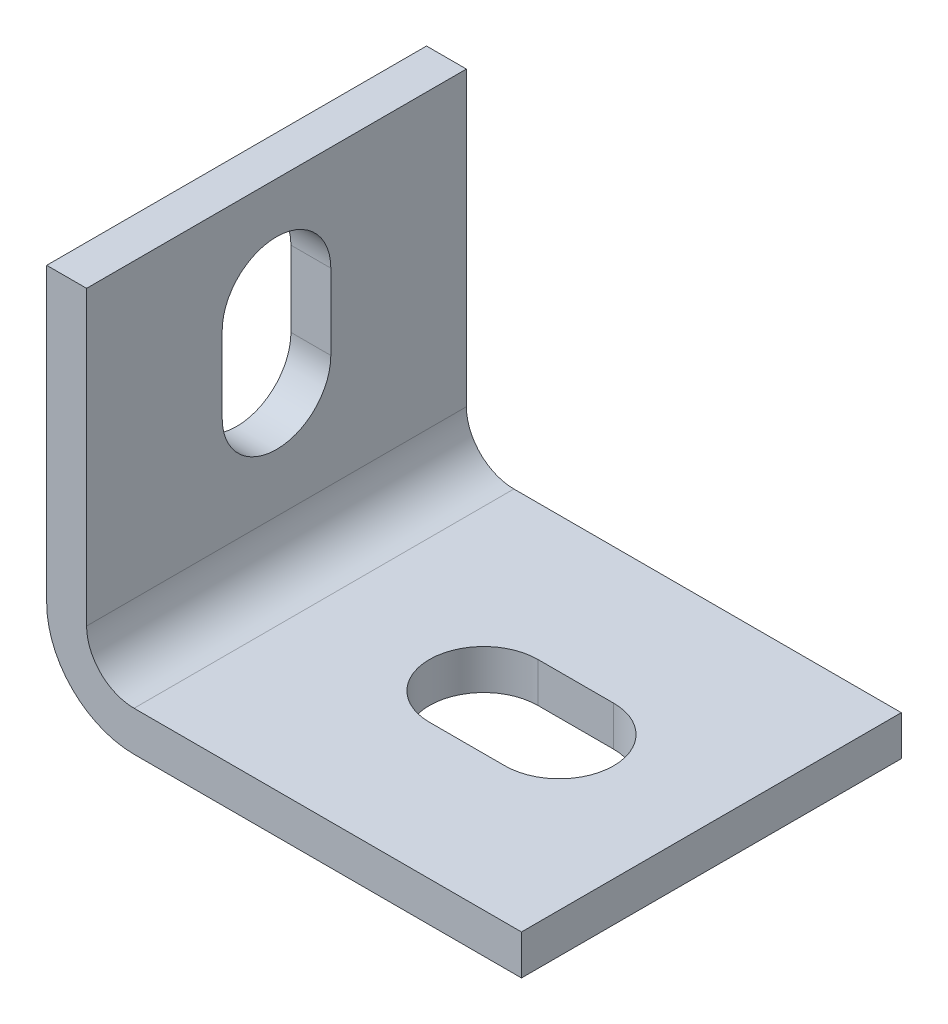
ISO-10303-21;
HEADER;
FILE_DESCRIPTION(('STEP AP214'),'2;1');
FILE_NAME('part.step','',(''),(''),'','','');
FILE_SCHEMA(('AUTOMOTIVE_DESIGN { 1 0 10303 214 1 1 1 1 }'));
ENDSEC;
DATA;
#1=APPLICATION_CONTEXT('core data for automotive mechanical design processes');
#2=APPLICATION_PROTOCOL_DEFINITION('international standard','automotive_design',2000,#1);
#3=PRODUCT_CONTEXT('',#1,'mechanical');
#4=PRODUCT('Part','Part','',(#3));
#5=PRODUCT_RELATED_PRODUCT_CATEGORY('part','',(#4));
#6=PRODUCT_DEFINITION_FORMATION('','',#4);
#7=PRODUCT_DEFINITION_CONTEXT('part definition',#1,'design');
#8=PRODUCT_DEFINITION('design','',#6,#7);
#9=PRODUCT_DEFINITION_SHAPE('','',#8);
#10=(LENGTH_UNIT() NAMED_UNIT(*) SI_UNIT(.MILLI.,.METRE.));
#11=(NAMED_UNIT(*) PLANE_ANGLE_UNIT() SI_UNIT($,.RADIAN.));
#12=(NAMED_UNIT(*) SI_UNIT($,.STERADIAN.) SOLID_ANGLE_UNIT());
#13=UNCERTAINTY_MEASURE_WITH_UNIT(LENGTH_MEASURE(1.E-05),#10,'distance_accuracy_value','');
#14=(GEOMETRIC_REPRESENTATION_CONTEXT(3) GLOBAL_UNCERTAINTY_ASSIGNED_CONTEXT((#13)) GLOBAL_UNIT_ASSIGNED_CONTEXT((#10,
#11,#12)) REPRESENTATION_CONTEXT('',''));
#15=CARTESIAN_POINT('',(0.,0.,0.));
#16=DIRECTION('',(0.,0.,1.));
#17=DIRECTION('',(1.,0.,0.));
#18=AXIS2_PLACEMENT_3D('',#15,#16,#17);
#19=CARTESIAN_POINT('',(0.,25.4,25.4));
#20=DIRECTION('',(0.,-1.,0.));
#21=DIRECTION('',(0.,0.,-1.));
#22=AXIS2_PLACEMENT_3D('',#19,#20,#21);
#23=PLANE('',#22);
#24=DIRECTION('',(-1.,0.,0.));
#25=VECTOR('',#24,1.);
#26=CARTESIAN_POINT('',(0.,25.4,0.));
#27=LINE('',#26,#25);
#28=CARTESIAN_POINT('',(2.667,25.4,0.));
#29=VERTEX_POINT('',#28);
#30=CARTESIAN_POINT('',(0.,25.4,0.));
#31=VERTEX_POINT('',#30);
#32=EDGE_CURVE('E210',#29,#31,#27,.T.);
#33=ORIENTED_EDGE('',*,*,#32,.T.);
#34=DIRECTION('',(0.,0.,-1.));
#35=VECTOR('',#34,1.);
#36=CARTESIAN_POINT('',(0.,25.4,25.4));
#37=LINE('',#36,#35);
#38=CARTESIAN_POINT('',(0.,25.4,25.4));
#39=VERTEX_POINT('',#38);
#40=EDGE_CURVE('E11',#39,#31,#37,.T.);
#41=ORIENTED_EDGE('',*,*,#40,.F.);
#42=DIRECTION('',(-1.,0.,0.));
#43=VECTOR('',#42,1.);
#44=CARTESIAN_POINT('',(0.,25.4,25.4));
#45=LINE('',#44,#43);
#46=CARTESIAN_POINT('',(2.667,25.4,25.4));
#47=VERTEX_POINT('',#46);
#48=EDGE_CURVE('E217',#47,#39,#45,.T.);
#49=ORIENTED_EDGE('',*,*,#48,.F.);
#50=DIRECTION('',(0.,0.,-1.));
#51=VECTOR('',#50,1.);
#52=CARTESIAN_POINT('',(2.667,25.4,25.4));
#53=LINE('',#52,#51);
#54=EDGE_CURVE('E235',#47,#29,#53,.T.);
#55=ORIENTED_EDGE('',*,*,#54,.T.);
#56=EDGE_LOOP('',(#33,#41,#49,#55));
#57=FACE_BOUND('',#56,.T.);
#58=ADVANCED_FACE('F36',(#57),#23,.F.);
#59=CARTESIAN_POINT('',(0.,5.842,25.4));
#60=DIRECTION('',(1.,0.,0.));
#61=DIRECTION('',(0.,0.,-1.));
#62=AXIS2_PLACEMENT_3D('',#59,#60,#61);
#63=PLANE('',#62);
#64=DIRECTION('',(0.,1.,0.));
#65=VECTOR('',#64,1.);
#66=CARTESIAN_POINT('',(0.,18.4023,9.0678));
#67=LINE('',#66,#65);
#68=CARTESIAN_POINT('',(0.,13.3477,9.0678));
#69=VERTEX_POINT('',#68);
#70=CARTESIAN_POINT('',(0.,18.4023,9.0678));
#71=VERTEX_POINT('',#70);
#72=EDGE_CURVE('E195',#69,#71,#67,.T.);
#73=ORIENTED_EDGE('',*,*,#72,.T.);
#74=CARTESIAN_POINT('',(0.,18.4023,12.7));
#75=DIRECTION('',(1.,0.,0.));
#76=DIRECTION('',(0.,1.,0.));
#77=AXIS2_PLACEMENT_3D('',#74,#75,#76);
#78=CIRCLE('',#77,3.6322);
#79=CARTESIAN_POINT('',(0.,18.4023,16.3322));
#80=VERTEX_POINT('',#79);
#81=EDGE_CURVE('E185',#71,#80,#78,.T.);
#82=ORIENTED_EDGE('',*,*,#81,.T.);
#83=DIRECTION('',(0.,-1.,0.));
#84=VECTOR('',#83,1.);
#85=CARTESIAN_POINT('',(0.,18.4023,16.3322));
#86=LINE('',#85,#84);
#87=CARTESIAN_POINT('',(0.,13.3477,16.3322));
#88=VERTEX_POINT('',#87);
#89=EDGE_CURVE('E188',#80,#88,#86,.T.);
#90=ORIENTED_EDGE('',*,*,#89,.T.);
#91=CARTESIAN_POINT('',(0.,13.3477,12.7));
#92=DIRECTION('',(1.,0.,0.));
#93=DIRECTION('',(0.,1.,0.));
#94=AXIS2_PLACEMENT_3D('',#91,#92,#93);
#95=CIRCLE('',#94,3.6322);
#96=EDGE_CURVE('E192',#88,#69,#95,.T.);
#97=ORIENTED_EDGE('',*,*,#96,.T.);
#98=EDGE_LOOP('',(#73,#82,#90,#97));
#99=FACE_BOUND('',#98,.T.);
#100=DIRECTION('',(0.,-1.,0.));
#101=VECTOR('',#100,1.);
#102=CARTESIAN_POINT('',(0.,5.842,0.));
#103=LINE('',#102,#101);
#104=CARTESIAN_POINT('',(0.,5.842,0.));
#105=VERTEX_POINT('',#104);
#106=EDGE_CURVE('E238',#31,#105,#103,.T.);
#107=ORIENTED_EDGE('',*,*,#106,.T.);
#108=DIRECTION('',(0.,0.,-1.));
#109=VECTOR('',#108,1.);
#110=CARTESIAN_POINT('',(0.,5.842,25.4));
#111=LINE('',#110,#109);
#112=CARTESIAN_POINT('',(0.,5.842,25.4));
#113=VERTEX_POINT('',#112);
#114=EDGE_CURVE('E43',#113,#105,#111,.T.);
#115=ORIENTED_EDGE('',*,*,#114,.F.);
#116=DIRECTION('',(0.,-1.,0.));
#117=VECTOR('',#116,1.);
#118=CARTESIAN_POINT('',(0.,5.842,25.4));
#119=LINE('',#118,#117);
#120=EDGE_CURVE('E220',#39,#113,#119,.T.);
#121=ORIENTED_EDGE('',*,*,#120,.F.);
#122=ORIENTED_EDGE('',*,*,#40,.T.);
#123=EDGE_LOOP('',(#107,#115,#121,#122));
#124=FACE_BOUND('',#123,.T.);
#125=ADVANCED_FACE('F293',(#99,#124),#63,.F.);
#126=CARTESIAN_POINT('',(5.842,5.842,25.4));
#127=DIRECTION('',(0.,0.,-1.));
#128=DIRECTION('',(-1.,0.,0.));
#129=AXIS2_PLACEMENT_3D('',#126,#127,#128);
#130=CYLINDRICAL_SURFACE('',#129,5.842);
#131=CARTESIAN_POINT('',(5.842,5.842,0.));
#132=DIRECTION('',(0.,0.,1.));
#133=DIRECTION('',(1.,0.,0.));
#134=AXIS2_PLACEMENT_3D('',#131,#132,#133);
#135=CIRCLE('',#134,5.842);
#136=CARTESIAN_POINT('',(5.842,0.,0.));
#137=VERTEX_POINT('',#136);
#138=EDGE_CURVE('E240',#105,#137,#135,.T.);
#139=ORIENTED_EDGE('',*,*,#138,.T.);
#140=DIRECTION('',(0.,0.,-1.));
#141=VECTOR('',#140,1.);
#142=CARTESIAN_POINT('',(5.842,0.,25.4));
#143=LINE('',#142,#141);
#144=CARTESIAN_POINT('',(5.842,0.,25.4));
#145=VERTEX_POINT('',#144);
#146=EDGE_CURVE('E265',#145,#137,#143,.T.);
#147=ORIENTED_EDGE('',*,*,#146,.F.);
#148=CARTESIAN_POINT('',(5.842,5.842,25.4));
#149=DIRECTION('',(0.,0.,1.));
#150=DIRECTION('',(1.,0.,0.));
#151=AXIS2_PLACEMENT_3D('',#148,#149,#150);
#152=CIRCLE('',#151,5.842);
#153=EDGE_CURVE('E223',#113,#145,#152,.T.);
#154=ORIENTED_EDGE('',*,*,#153,.F.);
#155=ORIENTED_EDGE('',*,*,#114,.T.);
#156=EDGE_LOOP('',(#139,#147,#154,#155));
#157=FACE_BOUND('',#156,.T.);
#158=ADVANCED_FACE('F272',(#157),#130,.T.);
#159=CARTESIAN_POINT('',(5.842,0.,25.4));
#160=DIRECTION('',(0.,1.,0.));
#161=DIRECTION('',(0.,0.,1.));
#162=AXIS2_PLACEMENT_3D('',#159,#160,#161);
#163=PLANE('',#162);
#164=DIRECTION('',(1.,0.,0.));
#165=VECTOR('',#164,1.);
#166=CARTESIAN_POINT('',(21.5773,0.,16.3322));
#167=LINE('',#166,#165);
#168=CARTESIAN_POINT('',(16.5227,0.,16.3322));
#169=VERTEX_POINT('',#168);
#170=CARTESIAN_POINT('',(21.5773,0.,16.3322));
#171=VERTEX_POINT('',#170);
#172=EDGE_CURVE('E156',#169,#171,#167,.T.);
#173=ORIENTED_EDGE('',*,*,#172,.T.);
#174=CARTESIAN_POINT('',(21.5773,0.,12.7));
#175=DIRECTION('',(0.,1.,0.));
#176=DIRECTION('',(-1.,0.,0.));
#177=AXIS2_PLACEMENT_3D('',#174,#175,#176);
#178=CIRCLE('',#177,3.6322);
#179=CARTESIAN_POINT('',(21.5773,0.,9.0678));
#180=VERTEX_POINT('',#179);
#181=EDGE_CURVE('E150',#171,#180,#178,.T.);
#182=ORIENTED_EDGE('',*,*,#181,.T.);
#183=DIRECTION('',(-1.,0.,0.));
#184=VECTOR('',#183,1.);
#185=CARTESIAN_POINT('',(21.5773,0.,9.0678));
#186=LINE('',#185,#184);
#187=CARTESIAN_POINT('',(16.5227,0.,9.0678));
#188=VERTEX_POINT('',#187);
#189=EDGE_CURVE('E159',#180,#188,#186,.T.);
#190=ORIENTED_EDGE('',*,*,#189,.T.);
#191=CARTESIAN_POINT('',(16.5227,0.,12.7));
#192=DIRECTION('',(0.,1.,0.));
#193=DIRECTION('',(-1.,0.,0.));
#194=AXIS2_PLACEMENT_3D('',#191,#192,#193);
#195=CIRCLE('',#194,3.6322);
#196=EDGE_CURVE('E50',#188,#169,#195,.T.);
#197=ORIENTED_EDGE('',*,*,#196,.T.);
#198=EDGE_LOOP('',(#173,#182,#190,#197));
#199=FACE_BOUND('',#198,.T.);
#200=DIRECTION('',(1.,0.,0.));
#201=VECTOR('',#200,1.);
#202=CARTESIAN_POINT('',(5.842,0.,0.));
#203=LINE('',#202,#201);
#204=CARTESIAN_POINT('',(31.75,0.,0.));
#205=VERTEX_POINT('',#204);
#206=EDGE_CURVE('E242',#137,#205,#203,.T.);
#207=ORIENTED_EDGE('',*,*,#206,.T.);
#208=DIRECTION('',(0.,0.,-1.));
#209=VECTOR('',#208,1.);
#210=CARTESIAN_POINT('',(31.75,0.,25.4));
#211=LINE('',#210,#209);
#212=CARTESIAN_POINT('',(31.75,0.,25.4));
#213=VERTEX_POINT('',#212);
#214=EDGE_CURVE('E262',#213,#205,#211,.T.);
#215=ORIENTED_EDGE('',*,*,#214,.F.);
#216=DIRECTION('',(1.,0.,0.));
#217=VECTOR('',#216,1.);
#218=CARTESIAN_POINT('',(5.842,0.,25.4));
#219=LINE('',#218,#217);
#220=EDGE_CURVE('E225',#145,#213,#219,.T.);
#221=ORIENTED_EDGE('',*,*,#220,.F.);
#222=ORIENTED_EDGE('',*,*,#146,.T.);
#223=EDGE_LOOP('',(#207,#215,#221,#222));
#224=FACE_BOUND('',#223,.T.);
#225=ADVANCED_FACE('F163',(#199,#224),#163,.F.);
#226=CARTESIAN_POINT('',(31.75,2.667,25.4));
#227=DIRECTION('',(-1.,0.,0.));
#228=DIRECTION('',(0.,0.,1.));
#229=AXIS2_PLACEMENT_3D('',#226,#227,#228);
#230=PLANE('',#229);
#231=DIRECTION('',(0.,1.,0.));
#232=VECTOR('',#231,1.);
#233=CARTESIAN_POINT('',(31.75,2.667,0.));
#234=LINE('',#233,#232);
#235=CARTESIAN_POINT('',(31.75,2.667,0.));
#236=VERTEX_POINT('',#235);
#237=EDGE_CURVE('E244',#205,#236,#234,.T.);
#238=ORIENTED_EDGE('',*,*,#237,.T.);
#239=DIRECTION('',(0.,0.,-1.));
#240=VECTOR('',#239,1.);
#241=CARTESIAN_POINT('',(31.75,2.667,25.4));
#242=LINE('',#241,#240);
#243=CARTESIAN_POINT('',(31.75,2.667,25.4));
#244=VERTEX_POINT('',#243);
#245=EDGE_CURVE('E259',#244,#236,#242,.T.);
#246=ORIENTED_EDGE('',*,*,#245,.F.);
#247=DIRECTION('',(0.,1.,0.));
#248=VECTOR('',#247,1.);
#249=CARTESIAN_POINT('',(31.75,2.667,25.4));
#250=LINE('',#249,#248);
#251=EDGE_CURVE('E227',#213,#244,#250,.T.);
#252=ORIENTED_EDGE('',*,*,#251,.F.);
#253=ORIENTED_EDGE('',*,*,#214,.T.);
#254=EDGE_LOOP('',(#238,#246,#252,#253));
#255=FACE_BOUND('',#254,.T.);
#256=ADVANCED_FACE('F285',(#255),#230,.F.);
#257=CARTESIAN_POINT('',(5.842,2.667,25.4));
#258=DIRECTION('',(0.,-1.,0.));
#259=DIRECTION('',(1.,0.,0.));
#260=AXIS2_PLACEMENT_3D('',#257,#258,#259);
#261=PLANE('',#260);
#262=DIRECTION('',(-1.,0.,0.));
#263=VECTOR('',#262,1.);
#264=CARTESIAN_POINT('',(21.5773,2.667,9.0678));
#265=LINE('',#264,#263);
#266=CARTESIAN_POINT('',(21.5773,2.667,9.0678));
#267=VERTEX_POINT('',#266);
#268=CARTESIAN_POINT('',(16.5227,2.667,9.0678));
#269=VERTEX_POINT('',#268);
#270=EDGE_CURVE('E175',#267,#269,#265,.T.);
#271=ORIENTED_EDGE('',*,*,#270,.F.);
#272=CARTESIAN_POINT('',(21.5773,2.667,12.7));
#273=DIRECTION('',(0.,1.,0.));
#274=DIRECTION('',(-1.,0.,0.));
#275=AXIS2_PLACEMENT_3D('',#272,#273,#274);
#276=CIRCLE('',#275,3.6322);
#277=CARTESIAN_POINT('',(21.5773,2.667,16.3322));
#278=VERTEX_POINT('',#277);
#279=EDGE_CURVE('E58',#278,#267,#276,.T.);
#280=ORIENTED_EDGE('',*,*,#279,.F.);
#281=DIRECTION('',(1.,0.,0.));
#282=VECTOR('',#281,1.);
#283=CARTESIAN_POINT('',(21.5773,2.667,16.3322));
#284=LINE('',#283,#282);
#285=CARTESIAN_POINT('',(16.5227,2.667,16.3322));
#286=VERTEX_POINT('',#285);
#287=EDGE_CURVE('E166',#286,#278,#284,.T.);
#288=ORIENTED_EDGE('',*,*,#287,.F.);
#289=CARTESIAN_POINT('',(16.5227,2.667,12.7));
#290=DIRECTION('',(0.,1.,0.));
#291=DIRECTION('',(-1.,0.,0.));
#292=AXIS2_PLACEMENT_3D('',#289,#290,#291);
#293=CIRCLE('',#292,3.6322);
#294=EDGE_CURVE('E169',#269,#286,#293,.T.);
#295=ORIENTED_EDGE('',*,*,#294,.F.);
#296=EDGE_LOOP('',(#271,#280,#288,#295));
#297=FACE_BOUND('',#296,.T.);
#298=DIRECTION('',(-1.,0.,0.));
#299=VECTOR('',#298,1.);
#300=CARTESIAN_POINT('',(5.842,2.667,0.));
#301=LINE('',#300,#299);
#302=CARTESIAN_POINT('',(5.842,2.667,0.));
#303=VERTEX_POINT('',#302);
#304=EDGE_CURVE('E246',#236,#303,#301,.T.);
#305=ORIENTED_EDGE('',*,*,#304,.T.);
#306=DIRECTION('',(0.,0.,-1.));
#307=VECTOR('',#306,1.);
#308=CARTESIAN_POINT('',(5.842,2.667,25.4));
#309=LINE('',#308,#307);
#310=CARTESIAN_POINT('',(5.842,2.667,25.4));
#311=VERTEX_POINT('',#310);
#312=EDGE_CURVE('E256',#311,#303,#309,.T.);
#313=ORIENTED_EDGE('',*,*,#312,.F.);
#314=DIRECTION('',(-1.,0.,0.));
#315=VECTOR('',#314,1.);
#316=CARTESIAN_POINT('',(5.842,2.667,25.4));
#317=LINE('',#316,#315);
#318=EDGE_CURVE('E229',#244,#311,#317,.T.);
#319=ORIENTED_EDGE('',*,*,#318,.F.);
#320=ORIENTED_EDGE('',*,*,#245,.T.);
#321=EDGE_LOOP('',(#305,#313,#319,#320));
#322=FACE_BOUND('',#321,.T.);
#323=ADVANCED_FACE('F306',(#297,#322),#261,.F.);
#324=CARTESIAN_POINT('',(5.842,5.842,25.4));
#325=DIRECTION('',(0.,0.,-1.));
#326=DIRECTION('',(-1.,0.,0.));
#327=AXIS2_PLACEMENT_3D('',#324,#325,#326);
#328=CYLINDRICAL_SURFACE('',#327,3.175);
#329=CARTESIAN_POINT('',(5.842,5.842,0.));
#330=DIRECTION('',(0.,0.,-1.));
#331=DIRECTION('',(-1.,0.,0.));
#332=AXIS2_PLACEMENT_3D('',#329,#330,#331);
#333=CIRCLE('',#332,3.175);
#334=CARTESIAN_POINT('',(2.667,5.842,0.));
#335=VERTEX_POINT('',#334);
#336=EDGE_CURVE('E248',#303,#335,#333,.T.);
#337=ORIENTED_EDGE('',*,*,#336,.T.);
#338=DIRECTION('',(0.,0.,-1.));
#339=VECTOR('',#338,1.);
#340=CARTESIAN_POINT('',(2.667,5.842,25.4));
#341=LINE('',#340,#339);
#342=CARTESIAN_POINT('',(2.667,5.842,25.4));
#343=VERTEX_POINT('',#342);
#344=EDGE_CURVE('E253',#343,#335,#341,.T.);
#345=ORIENTED_EDGE('',*,*,#344,.F.);
#346=CARTESIAN_POINT('',(5.842,5.842,25.4));
#347=DIRECTION('',(0.,0.,-1.));
#348=DIRECTION('',(-1.,0.,0.));
#349=AXIS2_PLACEMENT_3D('',#346,#347,#348);
#350=CIRCLE('',#349,3.175);
#351=EDGE_CURVE('E231',#311,#343,#350,.T.);
#352=ORIENTED_EDGE('',*,*,#351,.F.);
#353=ORIENTED_EDGE('',*,*,#312,.T.);
#354=EDGE_LOOP('',(#337,#345,#352,#353));
#355=FACE_BOUND('',#354,.T.);
#356=ADVANCED_FACE('F304',(#355),#328,.F.);
#357=CARTESIAN_POINT('',(2.667,5.842,25.4));
#358=DIRECTION('',(-1.,0.,0.));
#359=DIRECTION('',(0.,-1.,0.));
#360=AXIS2_PLACEMENT_3D('',#357,#358,#359);
#361=PLANE('',#360);
#362=DIRECTION('',(0.,-1.,0.));
#363=VECTOR('',#362,1.);
#364=CARTESIAN_POINT('',(2.667,18.4023,16.3322));
#365=LINE('',#364,#363);
#366=CARTESIAN_POINT('',(2.667,18.4023,16.3322));
#367=VERTEX_POINT('',#366);
#368=CARTESIAN_POINT('',(2.667,13.3477,16.3322));
#369=VERTEX_POINT('',#368);
#370=EDGE_CURVE('E200',#367,#369,#365,.T.);
#371=ORIENTED_EDGE('',*,*,#370,.F.);
#372=CARTESIAN_POINT('',(2.667,18.4023,12.7));
#373=DIRECTION('',(1.,0.,0.));
#374=DIRECTION('',(0.,1.,0.));
#375=AXIS2_PLACEMENT_3D('',#372,#373,#374);
#376=CIRCLE('',#375,3.6322);
#377=CARTESIAN_POINT('',(2.667,18.4023,9.0678));
#378=VERTEX_POINT('',#377);
#379=EDGE_CURVE('E181',#378,#367,#376,.T.);
#380=ORIENTED_EDGE('',*,*,#379,.F.);
#381=DIRECTION('',(0.,1.,0.));
#382=VECTOR('',#381,1.);
#383=CARTESIAN_POINT('',(2.667,18.4023,9.0678));
#384=LINE('',#383,#382);
#385=CARTESIAN_POINT('',(2.667,13.3477,9.0678));
#386=VERTEX_POINT('',#385);
#387=EDGE_CURVE('E189',#386,#378,#384,.T.);
#388=ORIENTED_EDGE('',*,*,#387,.F.);
#389=CARTESIAN_POINT('',(2.667,13.3477,12.7));
#390=DIRECTION('',(1.,0.,0.));
#391=DIRECTION('',(0.,1.,0.));
#392=AXIS2_PLACEMENT_3D('',#389,#390,#391);
#393=CIRCLE('',#392,3.6322);
#394=EDGE_CURVE('E203',#369,#386,#393,.T.);
#395=ORIENTED_EDGE('',*,*,#394,.F.);
#396=EDGE_LOOP('',(#371,#380,#388,#395));
#397=FACE_BOUND('',#396,.T.);
#398=DIRECTION('',(0.,1.,0.));
#399=VECTOR('',#398,1.);
#400=CARTESIAN_POINT('',(2.667,5.842,0.));
#401=LINE('',#400,#399);
#402=EDGE_CURVE('E221',#335,#29,#401,.T.);
#403=ORIENTED_EDGE('',*,*,#402,.T.);
#404=ORIENTED_EDGE('',*,*,#54,.F.);
#405=DIRECTION('',(0.,1.,0.));
#406=VECTOR('',#405,1.);
#407=CARTESIAN_POINT('',(2.667,5.842,25.4));
#408=LINE('',#407,#406);
#409=EDGE_CURVE('E233',#343,#47,#408,.T.);
#410=ORIENTED_EDGE('',*,*,#409,.F.);
#411=ORIENTED_EDGE('',*,*,#344,.T.);
#412=EDGE_LOOP('',(#403,#404,#410,#411));
#413=FACE_BOUND('',#412,.T.);
#414=ADVANCED_FACE('F299',(#397,#413),#361,.F.);
#415=CARTESIAN_POINT('',(5.842,5.842,25.4));
#416=DIRECTION('',(0.,0.,-1.));
#417=DIRECTION('',(-1.,0.,0.));
#418=AXIS2_PLACEMENT_3D('',#415,#416,#417);
#419=PLANE('',#418);
#420=ORIENTED_EDGE('',*,*,#48,.T.);
#421=ORIENTED_EDGE('',*,*,#120,.T.);
#422=ORIENTED_EDGE('',*,*,#153,.T.);
#423=ORIENTED_EDGE('',*,*,#220,.T.);
#424=ORIENTED_EDGE('',*,*,#251,.T.);
#425=ORIENTED_EDGE('',*,*,#318,.T.);
#426=ORIENTED_EDGE('',*,*,#351,.T.);
#427=ORIENTED_EDGE('',*,*,#409,.T.);
#428=EDGE_LOOP('',(#420,#421,#422,#423,#424,#425,#426,#427));
#429=FACE_BOUND('',#428,.T.);
#430=ADVANCED_FACE('F289',(#429),#419,.F.);
#431=CARTESIAN_POINT('',(5.842,5.842,0.));
#432=DIRECTION('',(0.,0.,-1.));
#433=DIRECTION('',(-1.,0.,0.));
#434=AXIS2_PLACEMENT_3D('',#431,#432,#433);
#435=PLANE('',#434);
#436=ORIENTED_EDGE('',*,*,#32,.F.);
#437=ORIENTED_EDGE('',*,*,#402,.F.);
#438=ORIENTED_EDGE('',*,*,#336,.F.);
#439=ORIENTED_EDGE('',*,*,#304,.F.);
#440=ORIENTED_EDGE('',*,*,#237,.F.);
#441=ORIENTED_EDGE('',*,*,#206,.F.);
#442=ORIENTED_EDGE('',*,*,#138,.F.);
#443=ORIENTED_EDGE('',*,*,#106,.F.);
#444=EDGE_LOOP('',(#436,#437,#438,#439,#440,#441,#442,#443));
#445=FACE_BOUND('',#444,.T.);
#446=ADVANCED_FACE('F278',(#445),#435,.T.);
#447=CARTESIAN_POINT('',(0.,18.4023,12.7));
#448=DIRECTION('',(1.,0.,0.));
#449=DIRECTION('',(0.,1.,0.));
#450=AXIS2_PLACEMENT_3D('',#447,#448,#449);
#451=CYLINDRICAL_SURFACE('',#450,3.6322);
#452=ORIENTED_EDGE('',*,*,#379,.T.);
#453=DIRECTION('',(1.,0.,0.));
#454=VECTOR('',#453,1.);
#455=CARTESIAN_POINT('',(0.,18.4023,16.3322));
#456=LINE('',#455,#454);
#457=EDGE_CURVE('E198',#80,#367,#456,.T.);
#458=ORIENTED_EDGE('',*,*,#457,.F.);
#459=ORIENTED_EDGE('',*,*,#81,.F.);
#460=DIRECTION('',(1.,0.,0.));
#461=VECTOR('',#460,1.);
#462=CARTESIAN_POINT('',(0.,18.4023,9.0678));
#463=LINE('',#462,#461);
#464=EDGE_CURVE('E208',#71,#378,#463,.T.);
#465=ORIENTED_EDGE('',*,*,#464,.T.);
#466=EDGE_LOOP('',(#452,#458,#459,#465));
#467=FACE_BOUND('',#466,.T.);
#468=ADVANCED_FACE('F363',(#467),#451,.F.);
#469=CARTESIAN_POINT('',(0.,18.4023,9.0678));
#470=DIRECTION('',(0.,0.,-1.));
#471=DIRECTION('',(-1.,0.,0.));
#472=AXIS2_PLACEMENT_3D('',#469,#470,#471);
#473=PLANE('',#472);
#474=ORIENTED_EDGE('',*,*,#387,.T.);
#475=ORIENTED_EDGE('',*,*,#464,.F.);
#476=ORIENTED_EDGE('',*,*,#72,.F.);
#477=DIRECTION('',(1.,0.,0.));
#478=VECTOR('',#477,1.);
#479=CARTESIAN_POINT('',(0.,13.3477,9.0678));
#480=LINE('',#479,#478);
#481=EDGE_CURVE('E211',#69,#386,#480,.T.);
#482=ORIENTED_EDGE('',*,*,#481,.T.);
#483=EDGE_LOOP('',(#474,#475,#476,#482));
#484=FACE_BOUND('',#483,.T.);
#485=ADVANCED_FACE('F385',(#484),#473,.F.);
#486=CARTESIAN_POINT('',(0.,13.3477,12.7));
#487=DIRECTION('',(1.,0.,0.));
#488=DIRECTION('',(0.,1.,0.));
#489=AXIS2_PLACEMENT_3D('',#486,#487,#488);
#490=CYLINDRICAL_SURFACE('',#489,3.6322);
#491=ORIENTED_EDGE('',*,*,#394,.T.);
#492=ORIENTED_EDGE('',*,*,#481,.F.);
#493=ORIENTED_EDGE('',*,*,#96,.F.);
#494=DIRECTION('',(1.,0.,0.));
#495=VECTOR('',#494,1.);
#496=CARTESIAN_POINT('',(0.,13.3477,16.3322));
#497=LINE('',#496,#495);
#498=EDGE_CURVE('E213',#88,#369,#497,.T.);
#499=ORIENTED_EDGE('',*,*,#498,.T.);
#500=EDGE_LOOP('',(#491,#492,#493,#499));
#501=FACE_BOUND('',#500,.T.);
#502=ADVANCED_FACE('F395',(#501),#490,.F.);
#503=CARTESIAN_POINT('',(0.,18.4023,16.3322));
#504=DIRECTION('',(0.,0.,1.));
#505=DIRECTION('',(1.,0.,0.));
#506=AXIS2_PLACEMENT_3D('',#503,#504,#505);
#507=PLANE('',#506);
#508=ORIENTED_EDGE('',*,*,#370,.T.);
#509=ORIENTED_EDGE('',*,*,#498,.F.);
#510=ORIENTED_EDGE('',*,*,#89,.F.);
#511=ORIENTED_EDGE('',*,*,#457,.T.);
#512=EDGE_LOOP('',(#508,#509,#510,#511));
#513=FACE_BOUND('',#512,.T.);
#514=ADVANCED_FACE('F404',(#513),#507,.F.);
#515=CARTESIAN_POINT('',(21.5773,0.,12.7));
#516=DIRECTION('',(0.,1.,0.));
#517=DIRECTION('',(-1.,0.,0.));
#518=AXIS2_PLACEMENT_3D('',#515,#516,#517);
#519=CYLINDRICAL_SURFACE('',#518,3.6322);
#520=ORIENTED_EDGE('',*,*,#279,.T.);
#521=DIRECTION('',(0.,1.,0.));
#522=VECTOR('',#521,1.);
#523=CARTESIAN_POINT('',(21.5773,0.,9.0678));
#524=LINE('',#523,#522);
#525=EDGE_CURVE('E146',#180,#267,#524,.T.);
#526=ORIENTED_EDGE('',*,*,#525,.F.);
#527=ORIENTED_EDGE('',*,*,#181,.F.);
#528=DIRECTION('',(0.,1.,0.));
#529=VECTOR('',#528,1.);
#530=CARTESIAN_POINT('',(21.5773,0.,16.3322));
#531=LINE('',#530,#529);
#532=EDGE_CURVE('E179',#171,#278,#531,.T.);
#533=ORIENTED_EDGE('',*,*,#532,.T.);
#534=EDGE_LOOP('',(#520,#526,#527,#533));
#535=FACE_BOUND('',#534,.T.);
#536=ADVANCED_FACE('F148',(#535),#519,.F.);
#537=CARTESIAN_POINT('',(21.5773,0.,16.3322));
#538=DIRECTION('',(0.,0.,1.));
#539=DIRECTION('',(1.,0.,0.));
#540=AXIS2_PLACEMENT_3D('',#537,#538,#539);
#541=PLANE('',#540);
#542=ORIENTED_EDGE('',*,*,#287,.T.);
#543=ORIENTED_EDGE('',*,*,#532,.F.);
#544=ORIENTED_EDGE('',*,*,#172,.F.);
#545=DIRECTION('',(0.,1.,0.));
#546=VECTOR('',#545,1.);
#547=CARTESIAN_POINT('',(16.5227,0.,16.3322));
#548=LINE('',#547,#546);
#549=EDGE_CURVE('E182',#169,#286,#548,.T.);
#550=ORIENTED_EDGE('',*,*,#549,.T.);
#551=EDGE_LOOP('',(#542,#543,#544,#550));
#552=FACE_BOUND('',#551,.T.);
#553=ADVANCED_FACE('F423',(#552),#541,.F.);
#554=CARTESIAN_POINT('',(16.5227,0.,12.7));
#555=DIRECTION('',(0.,1.,0.));
#556=DIRECTION('',(-1.,0.,0.));
#557=AXIS2_PLACEMENT_3D('',#554,#555,#556);
#558=CYLINDRICAL_SURFACE('',#557,3.6322);
#559=ORIENTED_EDGE('',*,*,#294,.T.);
#560=ORIENTED_EDGE('',*,*,#549,.F.);
#561=ORIENTED_EDGE('',*,*,#196,.F.);
#562=DIRECTION('',(0.,1.,0.));
#563=VECTOR('',#562,1.);
#564=CARTESIAN_POINT('',(16.5227,0.,9.0678));
#565=LINE('',#564,#563);
#566=EDGE_CURVE('E155',#188,#269,#565,.T.);
#567=ORIENTED_EDGE('',*,*,#566,.T.);
#568=EDGE_LOOP('',(#559,#560,#561,#567));
#569=FACE_BOUND('',#568,.T.);
#570=ADVANCED_FACE('F429',(#569),#558,.F.);
#571=CARTESIAN_POINT('',(21.5773,0.,9.0678));
#572=DIRECTION('',(0.,0.,-1.));
#573=DIRECTION('',(-1.,0.,0.));
#574=AXIS2_PLACEMENT_3D('',#571,#572,#573);
#575=PLANE('',#574);
#576=ORIENTED_EDGE('',*,*,#270,.T.);
#577=ORIENTED_EDGE('',*,*,#566,.F.);
#578=ORIENTED_EDGE('',*,*,#189,.F.);
#579=ORIENTED_EDGE('',*,*,#525,.T.);
#580=EDGE_LOOP('',(#576,#577,#578,#579));
#581=FACE_BOUND('',#580,.T.);
#582=ADVANCED_FACE('F160',(#581),#575,.F.);
#583=CLOSED_SHELL('',(#58,#125,#158,#225,#256,#323,#356,#414,#430,#446,#468,#485,#502,#514,#536,
#553,#570,#582));
#584=MANIFOLD_SOLID_BREP('B2',#583);
#585=ADVANCED_BREP_SHAPE_REPRESENTATION('',(#18,#584),#14);
#586=SHAPE_DEFINITION_REPRESENTATION(#9,#585);
ENDSEC;
END-ISO-10303-21;
